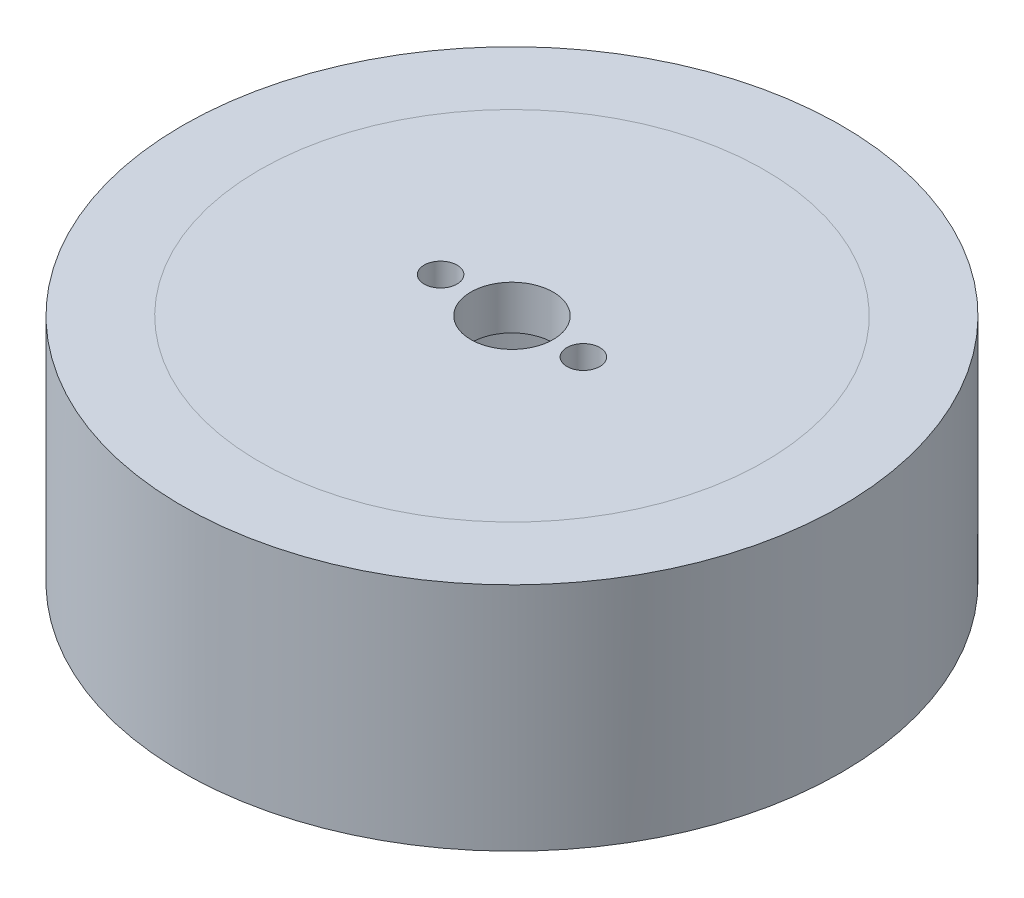
ISO-10303-21;
HEADER;
FILE_DESCRIPTION(('STEP AP214'),'2;1');
FILE_NAME('part.step','',(''),(''),'','','');
FILE_SCHEMA(('AUTOMOTIVE_DESIGN { 1 0 10303 214 1 1 1 1 }'));
ENDSEC;
DATA;
#1=APPLICATION_CONTEXT('core data for automotive mechanical design processes');
#2=APPLICATION_PROTOCOL_DEFINITION('international standard','automotive_design',2000,#1);
#3=PRODUCT_CONTEXT('',#1,'mechanical');
#4=PRODUCT('Part','Part','',(#3));
#5=PRODUCT_RELATED_PRODUCT_CATEGORY('part','',(#4));
#6=PRODUCT_DEFINITION_FORMATION('','',#4);
#7=PRODUCT_DEFINITION_CONTEXT('part definition',#1,'design');
#8=PRODUCT_DEFINITION('design','',#6,#7);
#9=PRODUCT_DEFINITION_SHAPE('','',#8);
#10=(LENGTH_UNIT() NAMED_UNIT(*) SI_UNIT(.MILLI.,.METRE.));
#11=(NAMED_UNIT(*) PLANE_ANGLE_UNIT() SI_UNIT($,.RADIAN.));
#12=(NAMED_UNIT(*) SI_UNIT($,.STERADIAN.) SOLID_ANGLE_UNIT());
#13=UNCERTAINTY_MEASURE_WITH_UNIT(LENGTH_MEASURE(1.E-05),#10,'distance_accuracy_value','');
#14=(GEOMETRIC_REPRESENTATION_CONTEXT(3) GLOBAL_UNCERTAINTY_ASSIGNED_CONTEXT((#13)) GLOBAL_UNIT_ASSIGNED_CONTEXT((#10,
#11,#12)) REPRESENTATION_CONTEXT('',''));
#15=CARTESIAN_POINT('',(0.,0.,0.));
#16=DIRECTION('',(0.,0.,1.));
#17=DIRECTION('',(1.,0.,0.));
#18=AXIS2_PLACEMENT_3D('',#15,#16,#17);
#19=CARTESIAN_POINT('',(0.,-105.852813742386,0.));
#20=DIRECTION('',(0.,1.,0.));
#21=DIRECTION('',(-1.,0.,0.));
#22=AXIS2_PLACEMENT_3D('',#19,#20,#21);
#23=CYLINDRICAL_SURFACE('',#22,30.);
#24=CARTESIAN_POINT('',(0.,0.,0.));
#25=DIRECTION('',(0.,1.,0.));
#26=DIRECTION('',(-1.,0.,0.));
#27=AXIS2_PLACEMENT_3D('',#24,#25,#26);
#28=CIRCLE('',#27,30.);
#29=CARTESIAN_POINT('',(-30.,0.,0.));
#30=VERTEX_POINT('',#29);
#31=EDGE_CURVE('E58',#30,#30,#28,.T.);
#32=ORIENTED_EDGE('',*,*,#31,.F.);
#33=EDGE_LOOP('',(#32));
#34=FACE_BOUND('',#33,.T.);
#35=CARTESIAN_POINT('',(0.,-21.,0.));
#36=DIRECTION('',(0.,-1.,0.));
#37=DIRECTION('',(1.,0.,0.));
#38=AXIS2_PLACEMENT_3D('',#35,#36,#37);
#39=CIRCLE('',#38,30.);
#40=CARTESIAN_POINT('',(30.,-21.,0.));
#41=VERTEX_POINT('',#40);
#42=EDGE_CURVE('E66',#41,#41,#39,.F.);
#43=ORIENTED_EDGE('',*,*,#42,.T.);
#44=EDGE_LOOP('',(#43));
#45=FACE_BOUND('',#44,.T.);
#46=ADVANCED_FACE('F52',(#34,#45),#23,.T.);
#47=CARTESIAN_POINT('',(0.,-105.852813742386,0.));
#48=DIRECTION('',(0.,1.,0.));
#49=DIRECTION('',(-1.,0.,0.));
#50=AXIS2_PLACEMENT_3D('',#47,#48,#49);
#51=CYLINDRICAL_SURFACE('',#50,23.);
#52=CARTESIAN_POINT('',(0.,0.,0.));
#53=DIRECTION('',(0.,1.,0.));
#54=DIRECTION('',(-1.,0.,0.));
#55=AXIS2_PLACEMENT_3D('',#52,#53,#54);
#56=CIRCLE('',#55,23.);
#57=CARTESIAN_POINT('',(-23.,0.,0.));
#58=VERTEX_POINT('',#57);
#59=EDGE_CURVE('E63',#58,#58,#56,.T.);
#60=ORIENTED_EDGE('',*,*,#59,.T.);
#61=EDGE_LOOP('',(#60));
#62=FACE_BOUND('',#61,.T.);
#63=CARTESIAN_POINT('',(0.,-21.,0.));
#64=DIRECTION('',(0.,-1.,0.));
#65=DIRECTION('',(1.,0.,0.));
#66=AXIS2_PLACEMENT_3D('',#63,#64,#65);
#67=CIRCLE('',#66,23.);
#68=CARTESIAN_POINT('',(23.,-21.,0.));
#69=VERTEX_POINT('',#68);
#70=EDGE_CURVE('E11',#69,#69,#67,.F.);
#71=ORIENTED_EDGE('',*,*,#70,.F.);
#72=EDGE_LOOP('',(#71));
#73=FACE_BOUND('',#72,.T.);
#74=ADVANCED_FACE('F78',(#62,#73),#51,.F.);
#75=CARTESIAN_POINT('',(0.,0.,0.));
#76=DIRECTION('',(0.,1.,0.));
#77=DIRECTION('',(-1.,0.,0.));
#78=AXIS2_PLACEMENT_3D('',#75,#76,#77);
#79=PLANE('',#78);
#80=ORIENTED_EDGE('',*,*,#59,.F.);
#81=EDGE_LOOP('',(#80));
#82=FACE_BOUND('',#81,.T.);
#83=ORIENTED_EDGE('',*,*,#31,.T.);
#84=EDGE_LOOP('',(#83));
#85=FACE_BOUND('',#84,.T.);
#86=ADVANCED_FACE('F77',(#82,#85),#79,.T.);
#87=CARTESIAN_POINT('',(-21.,-21.,0.));
#88=DIRECTION('',(0.,-1.,0.));
#89=DIRECTION('',(1.,0.,0.));
#90=AXIS2_PLACEMENT_3D('',#87,#88,#89);
#91=PLANE('',#90);
#92=ORIENTED_EDGE('',*,*,#42,.F.);
#93=EDGE_LOOP('',(#92));
#94=FACE_BOUND('',#93,.T.);
#95=ORIENTED_EDGE('',*,*,#70,.T.);
#96=EDGE_LOOP('',(#95));
#97=FACE_BOUND('',#96,.T.);
#98=ADVANCED_FACE('F54',(#94,#97),#91,.T.);
#99=CLOSED_SHELL('',(#46,#74,#86,#98));
#100=MANIFOLD_SOLID_BREP('B2',#99);
#101=CARTESIAN_POINT('',(-23.,0.,0.));
#102=DIRECTION('',(0.,1.,0.));
#103=DIRECTION('',(-1.,0.,0.));
#104=AXIS2_PLACEMENT_3D('',#101,#102,#103);
#105=PLANE('',#104);
#106=CARTESIAN_POINT('',(6.5,0.,0.));
#107=DIRECTION('',(0.,1.,0.));
#108=DIRECTION('',(-1.,0.,0.));
#109=AXIS2_PLACEMENT_3D('',#106,#107,#108);
#110=CIRCLE('',#109,1.5);
#111=CARTESIAN_POINT('',(6.5,0.,1.5));
#112=VERTEX_POINT('',#111);
#113=EDGE_CURVE('E168',#112,#112,#110,.T.);
#114=ORIENTED_EDGE('',*,*,#113,.F.);
#115=EDGE_LOOP('',(#114));
#116=FACE_BOUND('',#115,.T.);
#117=CARTESIAN_POINT('',(-6.5,0.,0.));
#118=DIRECTION('',(0.,1.,0.));
#119=DIRECTION('',(-1.,0.,0.));
#120=AXIS2_PLACEMENT_3D('',#117,#118,#119);
#121=CIRCLE('',#120,1.5);
#122=CARTESIAN_POINT('',(-6.5,0.,1.5));
#123=VERTEX_POINT('',#122);
#124=EDGE_CURVE('E159',#123,#123,#121,.T.);
#125=ORIENTED_EDGE('',*,*,#124,.F.);
#126=EDGE_LOOP('',(#125));
#127=FACE_BOUND('',#126,.T.);
#128=CARTESIAN_POINT('',(0.,0.,0.));
#129=DIRECTION('',(0.,1.,0.));
#130=DIRECTION('',(-1.,0.,0.));
#131=AXIS2_PLACEMENT_3D('',#128,#129,#130);
#132=CIRCLE('',#131,3.75);
#133=CARTESIAN_POINT('',(0.,0.,3.75));
#134=VERTEX_POINT('',#133);
#135=EDGE_CURVE('E160',#134,#134,#132,.T.);
#136=ORIENTED_EDGE('',*,*,#135,.F.);
#137=EDGE_LOOP('',(#136));
#138=FACE_BOUND('',#137,.T.);
#139=CARTESIAN_POINT('',(0.,0.,0.));
#140=DIRECTION('',(0.,1.,0.));
#141=DIRECTION('',(-1.,0.,0.));
#142=AXIS2_PLACEMENT_3D('',#139,#140,#141);
#143=CIRCLE('',#142,23.);
#144=CARTESIAN_POINT('',(-23.,0.,0.));
#145=VERTEX_POINT('',#144);
#146=EDGE_CURVE('E175',#145,#145,#143,.T.);
#147=ORIENTED_EDGE('',*,*,#146,.T.);
#148=EDGE_LOOP('',(#147));
#149=FACE_BOUND('',#148,.T.);
#150=ADVANCED_FACE('F140',(#116,#127,#138,#149),#105,.T.);
#151=CARTESIAN_POINT('',(0.,-4.,0.));
#152=DIRECTION('',(0.,-1.,0.));
#153=DIRECTION('',(1.,0.,0.));
#154=AXIS2_PLACEMENT_3D('',#151,#152,#153);
#155=PLANE('',#154);
#156=CARTESIAN_POINT('',(6.5,-4.,0.));
#157=DIRECTION('',(0.,-1.,0.));
#158=DIRECTION('',(1.,0.,0.));
#159=AXIS2_PLACEMENT_3D('',#156,#157,#158);
#160=CIRCLE('',#159,1.5);
#161=CARTESIAN_POINT('',(6.5,-4.,1.5));
#162=VERTEX_POINT('',#161);
#163=EDGE_CURVE('E142',#162,#162,#160,.T.);
#164=ORIENTED_EDGE('',*,*,#163,.F.);
#165=EDGE_LOOP('',(#164));
#166=FACE_BOUND('',#165,.T.);
#167=CARTESIAN_POINT('',(-6.5,-4.,0.));
#168=DIRECTION('',(0.,-1.,0.));
#169=DIRECTION('',(1.,0.,0.));
#170=AXIS2_PLACEMENT_3D('',#167,#168,#169);
#171=CIRCLE('',#170,1.5);
#172=CARTESIAN_POINT('',(-6.5,-4.,1.5));
#173=VERTEX_POINT('',#172);
#174=EDGE_CURVE('E158',#173,#173,#171,.T.);
#175=ORIENTED_EDGE('',*,*,#174,.F.);
#176=EDGE_LOOP('',(#175));
#177=FACE_BOUND('',#176,.T.);
#178=CARTESIAN_POINT('',(0.,-4.,0.));
#179=DIRECTION('',(0.,-1.,0.));
#180=DIRECTION('',(1.,0.,0.));
#181=AXIS2_PLACEMENT_3D('',#178,#179,#180);
#182=CIRCLE('',#181,3.75);
#183=CARTESIAN_POINT('',(0.,-4.,3.75));
#184=VERTEX_POINT('',#183);
#185=EDGE_CURVE('E154',#184,#184,#182,.T.);
#186=ORIENTED_EDGE('',*,*,#185,.F.);
#187=EDGE_LOOP('',(#186));
#188=FACE_BOUND('',#187,.T.);
#189=CARTESIAN_POINT('',(0.,-4.,0.));
#190=DIRECTION('',(0.,1.,0.));
#191=DIRECTION('',(-1.,0.,0.));
#192=AXIS2_PLACEMENT_3D('',#189,#190,#191);
#193=CIRCLE('',#192,21.);
#194=CARTESIAN_POINT('',(-21.,-4.,0.));
#195=VERTEX_POINT('',#194);
#196=EDGE_CURVE('E55',#195,#195,#193,.T.);
#197=ORIENTED_EDGE('',*,*,#196,.F.);
#198=EDGE_LOOP('',(#197));
#199=FACE_BOUND('',#198,.T.);
#200=ADVANCED_FACE('F194',(#166,#177,#188,#199),#155,.T.);
#201=CARTESIAN_POINT('',(0.,0.,0.));
#202=DIRECTION('',(0.,1.,0.));
#203=DIRECTION('',(-1.,0.,0.));
#204=AXIS2_PLACEMENT_3D('',#201,#202,#203);
#205=CYLINDRICAL_SURFACE('',#204,21.);
#206=ORIENTED_EDGE('',*,*,#196,.T.);
#207=EDGE_LOOP('',(#206));
#208=FACE_BOUND('',#207,.T.);
#209=CARTESIAN_POINT('',(0.,-21.,0.));
#210=DIRECTION('',(0.,1.,0.));
#211=DIRECTION('',(-1.,0.,0.));
#212=AXIS2_PLACEMENT_3D('',#209,#210,#211);
#213=CIRCLE('',#212,21.);
#214=CARTESIAN_POINT('',(-21.,-21.,0.));
#215=VERTEX_POINT('',#214);
#216=EDGE_CURVE('E148',#215,#215,#213,.T.);
#217=ORIENTED_EDGE('',*,*,#216,.F.);
#218=EDGE_LOOP('',(#217));
#219=FACE_BOUND('',#218,.T.);
#220=ADVANCED_FACE('F181',(#208,#219),#205,.F.);
#221=CARTESIAN_POINT('',(-21.,-21.,0.));
#222=DIRECTION('',(0.,-1.,0.));
#223=DIRECTION('',(1.,0.,0.));
#224=AXIS2_PLACEMENT_3D('',#221,#222,#223);
#225=PLANE('',#224);
#226=ORIENTED_EDGE('',*,*,#216,.T.);
#227=EDGE_LOOP('',(#226));
#228=FACE_BOUND('',#227,.T.);
#229=CARTESIAN_POINT('',(0.,-21.,0.));
#230=DIRECTION('',(0.,1.,0.));
#231=DIRECTION('',(-1.,0.,0.));
#232=AXIS2_PLACEMENT_3D('',#229,#230,#231);
#233=CIRCLE('',#232,23.);
#234=CARTESIAN_POINT('',(-23.,-21.,0.));
#235=VERTEX_POINT('',#234);
#236=EDGE_CURVE('E151',#235,#235,#233,.T.);
#237=ORIENTED_EDGE('',*,*,#236,.F.);
#238=EDGE_LOOP('',(#237));
#239=FACE_BOUND('',#238,.T.);
#240=ADVANCED_FACE('F182',(#228,#239),#225,.T.);
#241=CARTESIAN_POINT('',(0.,0.,0.));
#242=DIRECTION('',(0.,1.,0.));
#243=DIRECTION('',(-1.,0.,0.));
#244=AXIS2_PLACEMENT_3D('',#241,#242,#243);
#245=CYLINDRICAL_SURFACE('',#244,23.);
#246=ORIENTED_EDGE('',*,*,#236,.T.);
#247=EDGE_LOOP('',(#246));
#248=FACE_BOUND('',#247,.T.);
#249=ORIENTED_EDGE('',*,*,#146,.F.);
#250=EDGE_LOOP('',(#249));
#251=FACE_BOUND('',#250,.T.);
#252=ADVANCED_FACE('F179',(#248,#251),#245,.T.);
#253=CARTESIAN_POINT('',(0.,-21.,0.));
#254=DIRECTION('',(0.,1.,0.));
#255=DIRECTION('',(0.,0.,1.));
#256=AXIS2_PLACEMENT_3D('',#253,#254,#255);
#257=CYLINDRICAL_SURFACE('',#256,3.75);
#258=CARTESIAN_POINT('',(0.,0.,3.75));
#259=CARTESIAN_POINT('',(0.,-0.0416666666666667,3.75));
#260=CARTESIAN_POINT('',(0.,-0.0833333333333334,3.75));
#261=CARTESIAN_POINT('',(0.,-0.166666666666667,3.75));
#262=CARTESIAN_POINT('',(0.,-0.208333333333334,3.75));
#263=CARTESIAN_POINT('',(0.,-0.291666666666667,3.75));
#264=CARTESIAN_POINT('',(0.,-0.333333333333334,3.75));
#265=CARTESIAN_POINT('',(0.,-0.416666666666667,3.75));
#266=CARTESIAN_POINT('',(0.,-0.458333333333334,3.75));
#267=CARTESIAN_POINT('',(0.,-0.541666666666667,3.75));
#268=CARTESIAN_POINT('',(0.,-0.583333333333334,3.75));
#269=CARTESIAN_POINT('',(0.,-0.666666666666667,3.75));
#270=CARTESIAN_POINT('',(0.,-0.708333333333334,3.75));
#271=CARTESIAN_POINT('',(0.,-0.791666666666667,3.75));
#272=CARTESIAN_POINT('',(0.,-0.833333333333334,3.75));
#273=CARTESIAN_POINT('',(0.,-0.916666666666668,3.75));
#274=CARTESIAN_POINT('',(0.,-0.958333333333334,3.75));
#275=CARTESIAN_POINT('',(0.,-1.04166666666667,3.75));
#276=CARTESIAN_POINT('',(0.,-1.08333333333333,3.75));
#277=CARTESIAN_POINT('',(0.,-1.16666666666666,3.75));
#278=CARTESIAN_POINT('',(0.,-1.20833333333333,3.75));
#279=CARTESIAN_POINT('',(0.,-1.29166666666666,3.75));
#280=CARTESIAN_POINT('',(0.,-1.33333333333333,3.75));
#281=CARTESIAN_POINT('',(0.,-1.41666666666666,3.75));
#282=CARTESIAN_POINT('',(0.,-1.45833333333333,3.75));
#283=CARTESIAN_POINT('',(0.,-1.54166666666666,3.75));
#284=CARTESIAN_POINT('',(0.,-1.58333333333333,3.75));
#285=CARTESIAN_POINT('',(0.,-1.66666666666666,3.75));
#286=CARTESIAN_POINT('',(0.,-1.70833333333333,3.75));
#287=CARTESIAN_POINT('',(0.,-1.79166666666666,3.75));
#288=CARTESIAN_POINT('',(0.,-1.83333333333333,3.75));
#289=CARTESIAN_POINT('',(0.,-1.91666666666666,3.75));
#290=CARTESIAN_POINT('',(0.,-1.95833333333333,3.75));
#291=CARTESIAN_POINT('',(0.,-2.04166666666667,3.75));
#292=CARTESIAN_POINT('',(0.,-2.08333333333333,3.75));
#293=CARTESIAN_POINT('',(0.,-2.16666666666667,3.75));
#294=CARTESIAN_POINT('',(0.,-2.20833333333333,3.75));
#295=CARTESIAN_POINT('',(0.,-2.29166666666667,3.75));
#296=CARTESIAN_POINT('',(0.,-2.33333333333333,3.75));
#297=CARTESIAN_POINT('',(0.,-2.41666666666667,3.75));
#298=CARTESIAN_POINT('',(0.,-2.45833333333333,3.75));
#299=CARTESIAN_POINT('',(0.,-2.54166666666667,3.75));
#300=CARTESIAN_POINT('',(0.,-2.58333333333333,3.75));
#301=CARTESIAN_POINT('',(0.,-2.66666666666667,3.75));
#302=CARTESIAN_POINT('',(0.,-2.70833333333333,3.75));
#303=CARTESIAN_POINT('',(0.,-2.79166666666666,3.75));
#304=CARTESIAN_POINT('',(0.,-2.83333333333333,3.75));
#305=CARTESIAN_POINT('',(0.,-2.91666666666666,3.75));
#306=CARTESIAN_POINT('',(0.,-2.95833333333333,3.75));
#307=CARTESIAN_POINT('',(0.,-3.04166666666666,3.75));
#308=CARTESIAN_POINT('',(0.,-3.08333333333333,3.75));
#309=CARTESIAN_POINT('',(0.,-3.16666666666666,3.75));
#310=CARTESIAN_POINT('',(0.,-3.20833333333333,3.75));
#311=CARTESIAN_POINT('',(0.,-3.29166666666666,3.75));
#312=CARTESIAN_POINT('',(0.,-3.33333333333333,3.75));
#313=CARTESIAN_POINT('',(0.,-3.41666666666666,3.75));
#314=CARTESIAN_POINT('',(0.,-3.45833333333333,3.75));
#315=CARTESIAN_POINT('',(0.,-3.54166666666666,3.75));
#316=CARTESIAN_POINT('',(0.,-3.58333333333333,3.75));
#317=CARTESIAN_POINT('',(0.,-3.66666666666666,3.75));
#318=CARTESIAN_POINT('',(0.,-3.70833333333333,3.75));
#319=CARTESIAN_POINT('',(0.,-3.79166666666666,3.75));
#320=CARTESIAN_POINT('',(0.,-3.83333333333333,3.75));
#321=CARTESIAN_POINT('',(0.,-3.91666666666666,3.75));
#322=CARTESIAN_POINT('',(0.,-3.95833333333333,3.75));
#323=CARTESIAN_POINT('',(0.,-4.,3.75));
#324=B_SPLINE_CURVE_WITH_KNOTS('',3,(#258,#259,#260,#261,#262,#263,#264,#265,#266,#267,#268,
#269,#270,#271,#272,#273,#274,#275,#276,#277,#278,#279,#280,#281,#282,#283,#284,#285,#286,#287,
#288,#289,#290,#291,#292,#293,#294,#295,#296,#297,#298,#299,#300,#301,#302,#303,#304,#305,#306,
#307,#308,#309,#310,#311,#312,#313,#314,#315,#316,#317,#318,#319,#320,#321,#322,#323),
.UNSPECIFIED.,.F.,.F.,(4,2,2,2,2,2,2,2,2,2,2,2,2,2,2,2,2,2,2,2,2,2,2,2,2,2,2,2,2,2,2,2,4),(0.,
0.125,0.25,0.375,0.5,0.625000000000001,0.750000000000001,0.875000000000001,1.,1.125,1.25,1.375,
1.5,1.625,1.75,1.875,2.,2.125,2.25,2.375,2.5,2.625,2.75,2.875,3.,3.125,3.25,3.375,3.5,3.625,
3.75,3.875,4.),.UNSPECIFIED.);
#325=EDGE_CURVE('BSEAM188',#134,#184,#324,.T.);
#326=ORIENTED_EDGE('',*,*,#135,.T.);
#327=ORIENTED_EDGE('',*,*,#185,.T.);
#328=ORIENTED_EDGE('',*,*,#325,.T.);
#329=ORIENTED_EDGE('',*,*,#325,.F.);
#330=EDGE_LOOP('',(#326,#328,#327,#329));
#331=FACE_BOUND('',#330,.T.);
#332=ADVANCED_FACE('F188',(#331),#257,.F.);
#333=CARTESIAN_POINT('',(-6.5,-21.,0.));
#334=DIRECTION('',(0.,1.,0.));
#335=DIRECTION('',(0.,0.,1.));
#336=AXIS2_PLACEMENT_3D('',#333,#334,#335);
#337=CYLINDRICAL_SURFACE('',#336,1.5);
#338=CARTESIAN_POINT('',(-6.5,0.,1.5));
#339=CARTESIAN_POINT('',(-6.5,-0.0416666666666667,1.5));
#340=CARTESIAN_POINT('',(-6.5,-0.0833333333333334,1.5));
#341=CARTESIAN_POINT('',(-6.5,-0.166666666666667,1.5));
#342=CARTESIAN_POINT('',(-6.5,-0.208333333333334,1.5));
#343=CARTESIAN_POINT('',(-6.5,-0.291666666666667,1.5));
#344=CARTESIAN_POINT('',(-6.5,-0.333333333333334,1.5));
#345=CARTESIAN_POINT('',(-6.5,-0.416666666666667,1.5));
#346=CARTESIAN_POINT('',(-6.5,-0.458333333333334,1.5));
#347=CARTESIAN_POINT('',(-6.5,-0.541666666666667,1.5));
#348=CARTESIAN_POINT('',(-6.5,-0.583333333333334,1.5));
#349=CARTESIAN_POINT('',(-6.5,-0.666666666666667,1.5));
#350=CARTESIAN_POINT('',(-6.5,-0.708333333333334,1.5));
#351=CARTESIAN_POINT('',(-6.5,-0.791666666666667,1.5));
#352=CARTESIAN_POINT('',(-6.5,-0.833333333333334,1.5));
#353=CARTESIAN_POINT('',(-6.5,-0.916666666666668,1.5));
#354=CARTESIAN_POINT('',(-6.5,-0.958333333333334,1.5));
#355=CARTESIAN_POINT('',(-6.5,-1.04166666666667,1.5));
#356=CARTESIAN_POINT('',(-6.5,-1.08333333333333,1.5));
#357=CARTESIAN_POINT('',(-6.5,-1.16666666666666,1.5));
#358=CARTESIAN_POINT('',(-6.5,-1.20833333333333,1.5));
#359=CARTESIAN_POINT('',(-6.5,-1.29166666666666,1.5));
#360=CARTESIAN_POINT('',(-6.5,-1.33333333333333,1.5));
#361=CARTESIAN_POINT('',(-6.5,-1.41666666666666,1.5));
#362=CARTESIAN_POINT('',(-6.5,-1.45833333333333,1.5));
#363=CARTESIAN_POINT('',(-6.5,-1.54166666666666,1.5));
#364=CARTESIAN_POINT('',(-6.5,-1.58333333333333,1.5));
#365=CARTESIAN_POINT('',(-6.5,-1.66666666666666,1.5));
#366=CARTESIAN_POINT('',(-6.5,-1.70833333333333,1.5));
#367=CARTESIAN_POINT('',(-6.5,-1.79166666666666,1.5));
#368=CARTESIAN_POINT('',(-6.5,-1.83333333333333,1.5));
#369=CARTESIAN_POINT('',(-6.5,-1.91666666666666,1.5));
#370=CARTESIAN_POINT('',(-6.5,-1.95833333333333,1.5));
#371=CARTESIAN_POINT('',(-6.5,-2.04166666666667,1.5));
#372=CARTESIAN_POINT('',(-6.5,-2.08333333333333,1.5));
#373=CARTESIAN_POINT('',(-6.5,-2.16666666666667,1.5));
#374=CARTESIAN_POINT('',(-6.5,-2.20833333333333,1.5));
#375=CARTESIAN_POINT('',(-6.5,-2.29166666666667,1.5));
#376=CARTESIAN_POINT('',(-6.5,-2.33333333333333,1.5));
#377=CARTESIAN_POINT('',(-6.5,-2.41666666666667,1.5));
#378=CARTESIAN_POINT('',(-6.5,-2.45833333333333,1.5));
#379=CARTESIAN_POINT('',(-6.5,-2.54166666666667,1.5));
#380=CARTESIAN_POINT('',(-6.5,-2.58333333333333,1.5));
#381=CARTESIAN_POINT('',(-6.5,-2.66666666666667,1.5));
#382=CARTESIAN_POINT('',(-6.5,-2.70833333333333,1.5));
#383=CARTESIAN_POINT('',(-6.5,-2.79166666666666,1.5));
#384=CARTESIAN_POINT('',(-6.5,-2.83333333333333,1.5));
#385=CARTESIAN_POINT('',(-6.5,-2.91666666666666,1.5));
#386=CARTESIAN_POINT('',(-6.5,-2.95833333333333,1.5));
#387=CARTESIAN_POINT('',(-6.5,-3.04166666666666,1.5));
#388=CARTESIAN_POINT('',(-6.5,-3.08333333333333,1.5));
#389=CARTESIAN_POINT('',(-6.5,-3.16666666666666,1.5));
#390=CARTESIAN_POINT('',(-6.5,-3.20833333333333,1.5));
#391=CARTESIAN_POINT('',(-6.5,-3.29166666666666,1.5));
#392=CARTESIAN_POINT('',(-6.5,-3.33333333333333,1.5));
#393=CARTESIAN_POINT('',(-6.5,-3.41666666666666,1.5));
#394=CARTESIAN_POINT('',(-6.5,-3.45833333333333,1.5));
#395=CARTESIAN_POINT('',(-6.5,-3.54166666666666,1.5));
#396=CARTESIAN_POINT('',(-6.5,-3.58333333333333,1.5));
#397=CARTESIAN_POINT('',(-6.5,-3.66666666666666,1.5));
#398=CARTESIAN_POINT('',(-6.5,-3.70833333333333,1.5));
#399=CARTESIAN_POINT('',(-6.5,-3.79166666666666,1.5));
#400=CARTESIAN_POINT('',(-6.5,-3.83333333333333,1.5));
#401=CARTESIAN_POINT('',(-6.5,-3.91666666666666,1.5));
#402=CARTESIAN_POINT('',(-6.5,-3.95833333333333,1.5));
#403=CARTESIAN_POINT('',(-6.5,-4.,1.5));
#404=B_SPLINE_CURVE_WITH_KNOTS('',3,(#338,#339,#340,#341,#342,#343,#344,#345,#346,#347,#348,
#349,#350,#351,#352,#353,#354,#355,#356,#357,#358,#359,#360,#361,#362,#363,#364,#365,#366,#367,
#368,#369,#370,#371,#372,#373,#374,#375,#376,#377,#378,#379,#380,#381,#382,#383,#384,#385,#386,
#387,#388,#389,#390,#391,#392,#393,#394,#395,#396,#397,#398,#399,#400,#401,#402,#403),
.UNSPECIFIED.,.F.,.F.,(4,2,2,2,2,2,2,2,2,2,2,2,2,2,2,2,2,2,2,2,2,2,2,2,2,2,2,2,2,2,2,2,4),(0.,
0.125,0.25,0.375,0.5,0.625000000000001,0.750000000000001,0.875000000000001,1.,1.125,1.25,1.375,
1.5,1.625,1.75,1.875,2.,2.125,2.25,2.375,2.5,2.625,2.75,2.875,3.,3.125,3.25,3.375,3.5,3.625,
3.75,3.875,4.),.UNSPECIFIED.);
#405=EDGE_CURVE('BSEAM210',#123,#173,#404,.T.);
#406=ORIENTED_EDGE('',*,*,#124,.T.);
#407=ORIENTED_EDGE('',*,*,#174,.T.);
#408=ORIENTED_EDGE('',*,*,#405,.T.);
#409=ORIENTED_EDGE('',*,*,#405,.F.);
#410=EDGE_LOOP('',(#406,#408,#407,#409));
#411=FACE_BOUND('',#410,.T.);
#412=ADVANCED_FACE('F210',(#411),#337,.F.);
#413=CARTESIAN_POINT('',(6.5,-21.,0.));
#414=DIRECTION('',(0.,1.,0.));
#415=DIRECTION('',(0.,0.,1.));
#416=AXIS2_PLACEMENT_3D('',#413,#414,#415);
#417=CYLINDRICAL_SURFACE('',#416,1.5);
#418=CARTESIAN_POINT('',(6.5,0.,1.5));
#419=CARTESIAN_POINT('',(6.5,-0.0416666666666667,1.5));
#420=CARTESIAN_POINT('',(6.5,-0.0833333333333334,1.5));
#421=CARTESIAN_POINT('',(6.5,-0.166666666666667,1.5));
#422=CARTESIAN_POINT('',(6.5,-0.208333333333334,1.5));
#423=CARTESIAN_POINT('',(6.5,-0.291666666666667,1.5));
#424=CARTESIAN_POINT('',(6.5,-0.333333333333334,1.5));
#425=CARTESIAN_POINT('',(6.5,-0.416666666666667,1.5));
#426=CARTESIAN_POINT('',(6.5,-0.458333333333334,1.5));
#427=CARTESIAN_POINT('',(6.5,-0.541666666666667,1.5));
#428=CARTESIAN_POINT('',(6.5,-0.583333333333334,1.5));
#429=CARTESIAN_POINT('',(6.5,-0.666666666666667,1.5));
#430=CARTESIAN_POINT('',(6.5,-0.708333333333334,1.5));
#431=CARTESIAN_POINT('',(6.5,-0.791666666666667,1.5));
#432=CARTESIAN_POINT('',(6.5,-0.833333333333334,1.5));
#433=CARTESIAN_POINT('',(6.5,-0.916666666666668,1.5));
#434=CARTESIAN_POINT('',(6.5,-0.958333333333334,1.5));
#435=CARTESIAN_POINT('',(6.5,-1.04166666666667,1.5));
#436=CARTESIAN_POINT('',(6.5,-1.08333333333333,1.5));
#437=CARTESIAN_POINT('',(6.5,-1.16666666666666,1.5));
#438=CARTESIAN_POINT('',(6.5,-1.20833333333333,1.5));
#439=CARTESIAN_POINT('',(6.5,-1.29166666666666,1.5));
#440=CARTESIAN_POINT('',(6.5,-1.33333333333333,1.5));
#441=CARTESIAN_POINT('',(6.5,-1.41666666666666,1.5));
#442=CARTESIAN_POINT('',(6.5,-1.45833333333333,1.5));
#443=CARTESIAN_POINT('',(6.5,-1.54166666666666,1.5));
#444=CARTESIAN_POINT('',(6.5,-1.58333333333333,1.5));
#445=CARTESIAN_POINT('',(6.5,-1.66666666666666,1.5));
#446=CARTESIAN_POINT('',(6.5,-1.70833333333333,1.5));
#447=CARTESIAN_POINT('',(6.5,-1.79166666666666,1.5));
#448=CARTESIAN_POINT('',(6.5,-1.83333333333333,1.5));
#449=CARTESIAN_POINT('',(6.5,-1.91666666666666,1.5));
#450=CARTESIAN_POINT('',(6.5,-1.95833333333333,1.5));
#451=CARTESIAN_POINT('',(6.5,-2.04166666666667,1.5));
#452=CARTESIAN_POINT('',(6.5,-2.08333333333333,1.5));
#453=CARTESIAN_POINT('',(6.5,-2.16666666666667,1.5));
#454=CARTESIAN_POINT('',(6.5,-2.20833333333333,1.5));
#455=CARTESIAN_POINT('',(6.5,-2.29166666666667,1.5));
#456=CARTESIAN_POINT('',(6.5,-2.33333333333333,1.5));
#457=CARTESIAN_POINT('',(6.5,-2.41666666666667,1.5));
#458=CARTESIAN_POINT('',(6.5,-2.45833333333333,1.5));
#459=CARTESIAN_POINT('',(6.5,-2.54166666666667,1.5));
#460=CARTESIAN_POINT('',(6.5,-2.58333333333333,1.5));
#461=CARTESIAN_POINT('',(6.5,-2.66666666666667,1.5));
#462=CARTESIAN_POINT('',(6.5,-2.70833333333333,1.5));
#463=CARTESIAN_POINT('',(6.5,-2.79166666666666,1.5));
#464=CARTESIAN_POINT('',(6.5,-2.83333333333333,1.5));
#465=CARTESIAN_POINT('',(6.5,-2.91666666666666,1.5));
#466=CARTESIAN_POINT('',(6.5,-2.95833333333333,1.5));
#467=CARTESIAN_POINT('',(6.5,-3.04166666666666,1.5));
#468=CARTESIAN_POINT('',(6.5,-3.08333333333333,1.5));
#469=CARTESIAN_POINT('',(6.5,-3.16666666666666,1.5));
#470=CARTESIAN_POINT('',(6.5,-3.20833333333333,1.5));
#471=CARTESIAN_POINT('',(6.5,-3.29166666666666,1.5));
#472=CARTESIAN_POINT('',(6.5,-3.33333333333333,1.5));
#473=CARTESIAN_POINT('',(6.5,-3.41666666666666,1.5));
#474=CARTESIAN_POINT('',(6.5,-3.45833333333333,1.5));
#475=CARTESIAN_POINT('',(6.5,-3.54166666666666,1.5));
#476=CARTESIAN_POINT('',(6.5,-3.58333333333333,1.5));
#477=CARTESIAN_POINT('',(6.5,-3.66666666666666,1.5));
#478=CARTESIAN_POINT('',(6.5,-3.70833333333333,1.5));
#479=CARTESIAN_POINT('',(6.5,-3.79166666666666,1.5));
#480=CARTESIAN_POINT('',(6.5,-3.83333333333333,1.5));
#481=CARTESIAN_POINT('',(6.5,-3.91666666666666,1.5));
#482=CARTESIAN_POINT('',(6.5,-3.95833333333333,1.5));
#483=CARTESIAN_POINT('',(6.5,-4.,1.5));
#484=B_SPLINE_CURVE_WITH_KNOTS('',3,(#418,#419,#420,#421,#422,#423,#424,#425,#426,#427,#428,
#429,#430,#431,#432,#433,#434,#435,#436,#437,#438,#439,#440,#441,#442,#443,#444,#445,#446,#447,
#448,#449,#450,#451,#452,#453,#454,#455,#456,#457,#458,#459,#460,#461,#462,#463,#464,#465,#466,
#467,#468,#469,#470,#471,#472,#473,#474,#475,#476,#477,#478,#479,#480,#481,#482,#483),
.UNSPECIFIED.,.F.,.F.,(4,2,2,2,2,2,2,2,2,2,2,2,2,2,2,2,2,2,2,2,2,2,2,2,2,2,2,2,2,2,2,2,4),(0.,
0.125,0.25,0.375,0.5,0.625000000000001,0.750000000000001,0.875000000000001,1.,1.125,1.25,1.375,
1.5,1.625,1.75,1.875,2.,2.125,2.25,2.375,2.5,2.625,2.75,2.875,3.,3.125,3.25,3.375,3.5,3.625,
3.75,3.875,4.),.UNSPECIFIED.);
#485=EDGE_CURVE('BSEAM207',#112,#162,#484,.T.);
#486=ORIENTED_EDGE('',*,*,#113,.T.);
#487=ORIENTED_EDGE('',*,*,#163,.T.);
#488=ORIENTED_EDGE('',*,*,#485,.T.);
#489=ORIENTED_EDGE('',*,*,#485,.F.);
#490=EDGE_LOOP('',(#486,#488,#487,#489));
#491=FACE_BOUND('',#490,.T.);
#492=ADVANCED_FACE('F207',(#491),#417,.F.);
#493=CLOSED_SHELL('',(#150,#200,#220,#240,#252,#332,#412,#492));
#494=MANIFOLD_SOLID_BREP('B6',#493);
#495=ADVANCED_BREP_SHAPE_REPRESENTATION('',(#18,#100,#494),#14);
#496=SHAPE_DEFINITION_REPRESENTATION(#9,#495);
ENDSEC;
END-ISO-10303-21;
